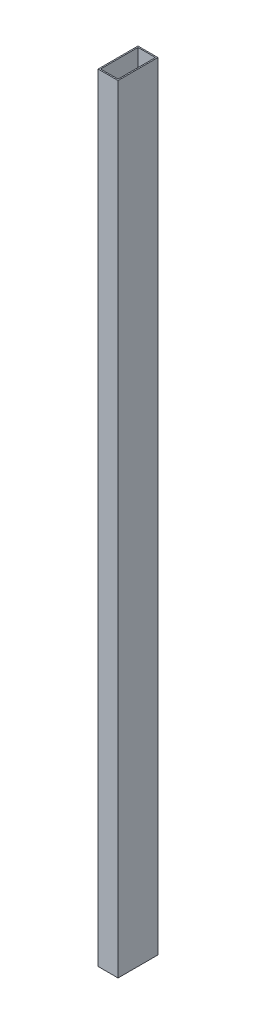
ISO-10303-21;
HEADER;
FILE_DESCRIPTION(('STEP AP214'),'2;1');
FILE_NAME('part.step','',(''),(''),'','','');
FILE_SCHEMA(('AUTOMOTIVE_DESIGN { 1 0 10303 214 1 1 1 1 }'));
ENDSEC;
DATA;
#1=APPLICATION_CONTEXT('core data for automotive mechanical design processes');
#2=APPLICATION_PROTOCOL_DEFINITION('international standard','automotive_design',2000,#1);
#3=PRODUCT_CONTEXT('',#1,'mechanical');
#4=PRODUCT('Part','Part','',(#3));
#5=PRODUCT_RELATED_PRODUCT_CATEGORY('part','',(#4));
#6=PRODUCT_DEFINITION_FORMATION('','',#4);
#7=PRODUCT_DEFINITION_CONTEXT('part definition',#1,'design');
#8=PRODUCT_DEFINITION('design','',#6,#7);
#9=PRODUCT_DEFINITION_SHAPE('','',#8);
#10=(LENGTH_UNIT() NAMED_UNIT(*) SI_UNIT(.MILLI.,.METRE.));
#11=(NAMED_UNIT(*) PLANE_ANGLE_UNIT() SI_UNIT($,.RADIAN.));
#12=(NAMED_UNIT(*) SI_UNIT($,.STERADIAN.) SOLID_ANGLE_UNIT());
#13=UNCERTAINTY_MEASURE_WITH_UNIT(LENGTH_MEASURE(1.E-05),#10,'distance_accuracy_value','');
#14=(GEOMETRIC_REPRESENTATION_CONTEXT(3) GLOBAL_UNCERTAINTY_ASSIGNED_CONTEXT((#13)) GLOBAL_UNIT_ASSIGNED_CONTEXT((#10,
#11,#12)) REPRESENTATION_CONTEXT('',''));
#15=CARTESIAN_POINT('',(0.,0.,0.));
#16=DIRECTION('',(0.,0.,1.));
#17=DIRECTION('',(1.,0.,0.));
#18=AXIS2_PLACEMENT_3D('',#15,#16,#17);
#19=CARTESIAN_POINT('',(0.,990.6,0.));
#20=DIRECTION('',(0.,1.,0.));
#21=DIRECTION('',(0.,0.,1.));
#22=AXIS2_PLACEMENT_3D('',#19,#20,#21);
#23=PLANE('',#22);
#24=DIRECTION('',(0.,0.,1.));
#25=VECTOR('',#24,1.);
#26=CARTESIAN_POINT('',(0.,990.6,0.));
#27=LINE('',#26,#25);
#28=CARTESIAN_POINT('',(0.,990.6,-50.8));
#29=VERTEX_POINT('',#28);
#30=CARTESIAN_POINT('',(0.,990.6,0.));
#31=VERTEX_POINT('',#30);
#32=EDGE_CURVE('E177',#29,#31,#27,.T.);
#33=ORIENTED_EDGE('',*,*,#32,.T.);
#34=DIRECTION('',(1.,0.,0.));
#35=VECTOR('',#34,1.);
#36=CARTESIAN_POINT('',(0.,990.6,0.));
#37=LINE('',#36,#35);
#38=CARTESIAN_POINT('',(25.4,990.6,0.));
#39=VERTEX_POINT('',#38);
#40=EDGE_CURVE('E181',#31,#39,#37,.T.);
#41=ORIENTED_EDGE('',*,*,#40,.T.);
#42=DIRECTION('',(0.,0.,-1.));
#43=VECTOR('',#42,1.);
#44=CARTESIAN_POINT('',(25.4,990.6,0.));
#45=LINE('',#44,#43);
#46=CARTESIAN_POINT('',(25.4,990.6,-50.8));
#47=VERTEX_POINT('',#46);
#48=EDGE_CURVE('E185',#39,#47,#45,.T.);
#49=ORIENTED_EDGE('',*,*,#48,.T.);
#50=DIRECTION('',(-1.,0.,0.));
#51=VECTOR('',#50,1.);
#52=CARTESIAN_POINT('',(0.,990.6,-50.8));
#53=LINE('',#52,#51);
#54=EDGE_CURVE('E188',#47,#29,#53,.T.);
#55=ORIENTED_EDGE('',*,*,#54,.T.);
#56=EDGE_LOOP('',(#33,#41,#49,#55));
#57=FACE_BOUND('',#56,.T.);
#58=DIRECTION('',(1.,0.,0.));
#59=VECTOR('',#58,1.);
#60=CARTESIAN_POINT('',(0.,990.6,-1.524));
#61=LINE('',#60,#59);
#62=CARTESIAN_POINT('',(1.524,990.6,-1.524));
#63=VERTEX_POINT('',#62);
#64=CARTESIAN_POINT('',(23.876,990.6,-1.524));
#65=VERTEX_POINT('',#64);
#66=EDGE_CURVE('E138',#63,#65,#61,.T.);
#67=ORIENTED_EDGE('',*,*,#66,.F.);
#68=DIRECTION('',(0.,0.,1.));
#69=VECTOR('',#68,1.);
#70=CARTESIAN_POINT('',(1.524,990.6,0.));
#71=LINE('',#70,#69);
#72=CARTESIAN_POINT('',(1.52399999999999,990.6,-49.276));
#73=VERTEX_POINT('',#72);
#74=EDGE_CURVE('E129',#73,#63,#71,.T.);
#75=ORIENTED_EDGE('',*,*,#74,.F.);
#76=DIRECTION('',(-1.,0.,0.));
#77=VECTOR('',#76,1.);
#78=CARTESIAN_POINT('',(0.,990.6,-49.276));
#79=LINE('',#78,#77);
#80=CARTESIAN_POINT('',(23.876,990.6,-49.276));
#81=VERTEX_POINT('',#80);
#82=EDGE_CURVE('E155',#81,#73,#79,.T.);
#83=ORIENTED_EDGE('',*,*,#82,.F.);
#84=DIRECTION('',(0.,0.,-1.));
#85=VECTOR('',#84,1.);
#86=CARTESIAN_POINT('',(23.876,990.6,0.));
#87=LINE('',#86,#85);
#88=EDGE_CURVE('E151',#65,#81,#87,.T.);
#89=ORIENTED_EDGE('',*,*,#88,.F.);
#90=EDGE_LOOP('',(#67,#75,#83,#89));
#91=FACE_BOUND('',#90,.T.);
#92=ADVANCED_FACE('F63',(#57,#91),#23,.T.);
#93=CARTESIAN_POINT('',(0.,0.,0.));
#94=DIRECTION('',(0.,1.,0.));
#95=DIRECTION('',(0.,0.,1.));
#96=AXIS2_PLACEMENT_3D('',#93,#94,#95);
#97=PLANE('',#96);
#98=DIRECTION('',(0.,0.,1.));
#99=VECTOR('',#98,1.);
#100=CARTESIAN_POINT('',(0.,0.,0.));
#101=LINE('',#100,#99);
#102=CARTESIAN_POINT('',(0.,0.,-50.8));
#103=VERTEX_POINT('',#102);
#104=CARTESIAN_POINT('',(0.,0.,0.));
#105=VERTEX_POINT('',#104);
#106=EDGE_CURVE('E147',#103,#105,#101,.T.);
#107=ORIENTED_EDGE('',*,*,#106,.F.);
#108=DIRECTION('',(-1.,0.,0.));
#109=VECTOR('',#108,1.);
#110=CARTESIAN_POINT('',(0.,0.,-50.8));
#111=LINE('',#110,#109);
#112=CARTESIAN_POINT('',(25.4,0.,-50.8));
#113=VERTEX_POINT('',#112);
#114=EDGE_CURVE('E182',#113,#103,#111,.T.);
#115=ORIENTED_EDGE('',*,*,#114,.F.);
#116=DIRECTION('',(0.,0.,-1.));
#117=VECTOR('',#116,1.);
#118=CARTESIAN_POINT('',(25.4,0.,0.));
#119=LINE('',#118,#117);
#120=CARTESIAN_POINT('',(25.4,0.,0.));
#121=VERTEX_POINT('',#120);
#122=EDGE_CURVE('E198',#121,#113,#119,.T.);
#123=ORIENTED_EDGE('',*,*,#122,.F.);
#124=DIRECTION('',(1.,0.,0.));
#125=VECTOR('',#124,1.);
#126=CARTESIAN_POINT('',(0.,0.,0.));
#127=LINE('',#126,#125);
#128=EDGE_CURVE('E195',#105,#121,#127,.T.);
#129=ORIENTED_EDGE('',*,*,#128,.F.);
#130=EDGE_LOOP('',(#107,#115,#123,#129));
#131=FACE_BOUND('',#130,.T.);
#132=DIRECTION('',(0.,0.,1.));
#133=VECTOR('',#132,1.);
#134=CARTESIAN_POINT('',(1.524,0.,0.));
#135=LINE('',#134,#133);
#136=CARTESIAN_POINT('',(1.52399999999999,0.,-49.276));
#137=VERTEX_POINT('',#136);
#138=CARTESIAN_POINT('',(1.524,0.,-1.524));
#139=VERTEX_POINT('',#138);
#140=EDGE_CURVE('E87',#137,#139,#135,.T.);
#141=ORIENTED_EDGE('',*,*,#140,.T.);
#142=DIRECTION('',(1.,0.,0.));
#143=VECTOR('',#142,1.);
#144=CARTESIAN_POINT('',(0.,0.,-1.524));
#145=LINE('',#144,#143);
#146=CARTESIAN_POINT('',(23.876,0.,-1.524));
#147=VERTEX_POINT('',#146);
#148=EDGE_CURVE('E145',#139,#147,#145,.T.);
#149=ORIENTED_EDGE('',*,*,#148,.T.);
#150=DIRECTION('',(0.,0.,-1.));
#151=VECTOR('',#150,1.);
#152=CARTESIAN_POINT('',(23.876,0.,0.));
#153=LINE('',#152,#151);
#154=CARTESIAN_POINT('',(23.876,0.,-49.276));
#155=VERTEX_POINT('',#154);
#156=EDGE_CURVE('E164',#147,#155,#153,.T.);
#157=ORIENTED_EDGE('',*,*,#156,.T.);
#158=DIRECTION('',(-1.,0.,0.));
#159=VECTOR('',#158,1.);
#160=CARTESIAN_POINT('',(0.,0.,-49.276));
#161=LINE('',#160,#159);
#162=EDGE_CURVE('E139',#155,#137,#161,.T.);
#163=ORIENTED_EDGE('',*,*,#162,.T.);
#164=EDGE_LOOP('',(#141,#149,#157,#163));
#165=FACE_BOUND('',#164,.T.);
#166=ADVANCED_FACE('F221',(#131,#165),#97,.F.);
#167=CARTESIAN_POINT('',(0.,990.6,0.));
#168=DIRECTION('',(1.,0.,0.));
#169=DIRECTION('',(0.,0.,-1.));
#170=AXIS2_PLACEMENT_3D('',#167,#168,#169);
#171=PLANE('',#170);
#172=ORIENTED_EDGE('',*,*,#106,.T.);
#173=DIRECTION('',(0.,-1.,0.));
#174=VECTOR('',#173,1.);
#175=CARTESIAN_POINT('',(0.,990.6,0.));
#176=LINE('',#175,#174);
#177=EDGE_CURVE('E12',#31,#105,#176,.T.);
#178=ORIENTED_EDGE('',*,*,#177,.F.);
#179=ORIENTED_EDGE('',*,*,#32,.F.);
#180=DIRECTION('',(0.,-1.,0.));
#181=VECTOR('',#180,1.);
#182=CARTESIAN_POINT('',(0.,990.6,-50.8));
#183=LINE('',#182,#181);
#184=EDGE_CURVE('E191',#29,#103,#183,.T.);
#185=ORIENTED_EDGE('',*,*,#184,.T.);
#186=EDGE_LOOP('',(#172,#178,#179,#185));
#187=FACE_BOUND('',#186,.T.);
#188=ADVANCED_FACE('F65',(#187),#171,.F.);
#189=CARTESIAN_POINT('',(0.,990.6,0.));
#190=DIRECTION('',(0.,0.,-1.));
#191=DIRECTION('',(-1.,0.,0.));
#192=AXIS2_PLACEMENT_3D('',#189,#190,#191);
#193=PLANE('',#192);
#194=ORIENTED_EDGE('',*,*,#128,.T.);
#195=DIRECTION('',(0.,-1.,0.));
#196=VECTOR('',#195,1.);
#197=CARTESIAN_POINT('',(25.4,990.6,0.));
#198=LINE('',#197,#196);
#199=EDGE_CURVE('E72',#39,#121,#198,.T.);
#200=ORIENTED_EDGE('',*,*,#199,.F.);
#201=ORIENTED_EDGE('',*,*,#40,.F.);
#202=ORIENTED_EDGE('',*,*,#177,.T.);
#203=EDGE_LOOP('',(#194,#200,#201,#202));
#204=FACE_BOUND('',#203,.T.);
#205=ADVANCED_FACE('F231',(#204),#193,.F.);
#206=CARTESIAN_POINT('',(25.4,990.6,0.));
#207=DIRECTION('',(-1.,0.,0.));
#208=DIRECTION('',(0.,0.,1.));
#209=AXIS2_PLACEMENT_3D('',#206,#207,#208);
#210=PLANE('',#209);
#211=ORIENTED_EDGE('',*,*,#122,.T.);
#212=DIRECTION('',(0.,-1.,0.));
#213=VECTOR('',#212,1.);
#214=CARTESIAN_POINT('',(25.4,990.6,-50.8));
#215=LINE('',#214,#213);
#216=EDGE_CURVE('E206',#47,#113,#215,.T.);
#217=ORIENTED_EDGE('',*,*,#216,.F.);
#218=ORIENTED_EDGE('',*,*,#48,.F.);
#219=ORIENTED_EDGE('',*,*,#199,.T.);
#220=EDGE_LOOP('',(#211,#217,#218,#219));
#221=FACE_BOUND('',#220,.T.);
#222=ADVANCED_FACE('F215',(#221),#210,.F.);
#223=CARTESIAN_POINT('',(0.,990.6,-50.8));
#224=DIRECTION('',(0.,0.,1.));
#225=DIRECTION('',(1.,0.,0.));
#226=AXIS2_PLACEMENT_3D('',#223,#224,#225);
#227=PLANE('',#226);
#228=ORIENTED_EDGE('',*,*,#114,.T.);
#229=ORIENTED_EDGE('',*,*,#184,.F.);
#230=ORIENTED_EDGE('',*,*,#54,.F.);
#231=ORIENTED_EDGE('',*,*,#216,.T.);
#232=EDGE_LOOP('',(#228,#229,#230,#231));
#233=FACE_BOUND('',#232,.T.);
#234=ADVANCED_FACE('F225',(#233),#227,.F.);
#235=CARTESIAN_POINT('',(1.524,990.6,0.));
#236=DIRECTION('',(1.,0.,0.));
#237=DIRECTION('',(0.,0.,-1.));
#238=AXIS2_PLACEMENT_3D('',#235,#236,#237);
#239=PLANE('',#238);
#240=ORIENTED_EDGE('',*,*,#140,.F.);
#241=DIRECTION('',(0.,-1.,0.));
#242=VECTOR('',#241,1.);
#243=CARTESIAN_POINT('',(1.52399999999999,990.6,-49.276));
#244=LINE('',#243,#242);
#245=EDGE_CURVE('E133',#73,#137,#244,.T.);
#246=ORIENTED_EDGE('',*,*,#245,.F.);
#247=ORIENTED_EDGE('',*,*,#74,.T.);
#248=DIRECTION('',(0.,-1.,0.));
#249=VECTOR('',#248,1.);
#250=CARTESIAN_POINT('',(1.524,990.6,-1.524));
#251=LINE('',#250,#249);
#252=EDGE_CURVE('E132',#63,#139,#251,.T.);
#253=ORIENTED_EDGE('',*,*,#252,.T.);
#254=EDGE_LOOP('',(#240,#246,#247,#253));
#255=FACE_BOUND('',#254,.T.);
#256=ADVANCED_FACE('F131',(#255),#239,.T.);
#257=CARTESIAN_POINT('',(0.,990.6,-1.524));
#258=DIRECTION('',(0.,0.,-1.));
#259=DIRECTION('',(-1.,0.,0.));
#260=AXIS2_PLACEMENT_3D('',#257,#258,#259);
#261=PLANE('',#260);
#262=ORIENTED_EDGE('',*,*,#148,.F.);
#263=ORIENTED_EDGE('',*,*,#252,.F.);
#264=ORIENTED_EDGE('',*,*,#66,.T.);
#265=DIRECTION('',(0.,-1.,0.));
#266=VECTOR('',#265,1.);
#267=CARTESIAN_POINT('',(23.876,990.6,-1.524));
#268=LINE('',#267,#266);
#269=EDGE_CURVE('E148',#65,#147,#268,.T.);
#270=ORIENTED_EDGE('',*,*,#269,.T.);
#271=EDGE_LOOP('',(#262,#263,#264,#270));
#272=FACE_BOUND('',#271,.T.);
#273=ADVANCED_FACE('F142',(#272),#261,.T.);
#274=CARTESIAN_POINT('',(23.876,990.6,0.));
#275=DIRECTION('',(-1.,0.,0.));
#276=DIRECTION('',(0.,0.,1.));
#277=AXIS2_PLACEMENT_3D('',#274,#275,#276);
#278=PLANE('',#277);
#279=ORIENTED_EDGE('',*,*,#156,.F.);
#280=ORIENTED_EDGE('',*,*,#269,.F.);
#281=ORIENTED_EDGE('',*,*,#88,.T.);
#282=DIRECTION('',(0.,-1.,0.));
#283=VECTOR('',#282,1.);
#284=CARTESIAN_POINT('',(23.876,990.6,-49.276));
#285=LINE('',#284,#283);
#286=EDGE_CURVE('E79',#81,#155,#285,.T.);
#287=ORIENTED_EDGE('',*,*,#286,.T.);
#288=EDGE_LOOP('',(#279,#280,#281,#287));
#289=FACE_BOUND('',#288,.T.);
#290=ADVANCED_FACE('F254',(#289),#278,.T.);
#291=CARTESIAN_POINT('',(0.,990.6,-49.276));
#292=DIRECTION('',(0.,0.,1.));
#293=DIRECTION('',(1.,0.,0.));
#294=AXIS2_PLACEMENT_3D('',#291,#292,#293);
#295=PLANE('',#294);
#296=ORIENTED_EDGE('',*,*,#162,.F.);
#297=ORIENTED_EDGE('',*,*,#286,.F.);
#298=ORIENTED_EDGE('',*,*,#82,.T.);
#299=ORIENTED_EDGE('',*,*,#245,.T.);
#300=EDGE_LOOP('',(#296,#297,#298,#299));
#301=FACE_BOUND('',#300,.T.);
#302=ADVANCED_FACE('F258',(#301),#295,.T.);
#303=CLOSED_SHELL('',(#92,#166,#188,#205,#222,#234,#256,#273,#290,#302));
#304=MANIFOLD_SOLID_BREP('B2',#303);
#305=ADVANCED_BREP_SHAPE_REPRESENTATION('',(#18,#304),#14);
#306=SHAPE_DEFINITION_REPRESENTATION(#9,#305);
ENDSEC;
END-ISO-10303-21;
